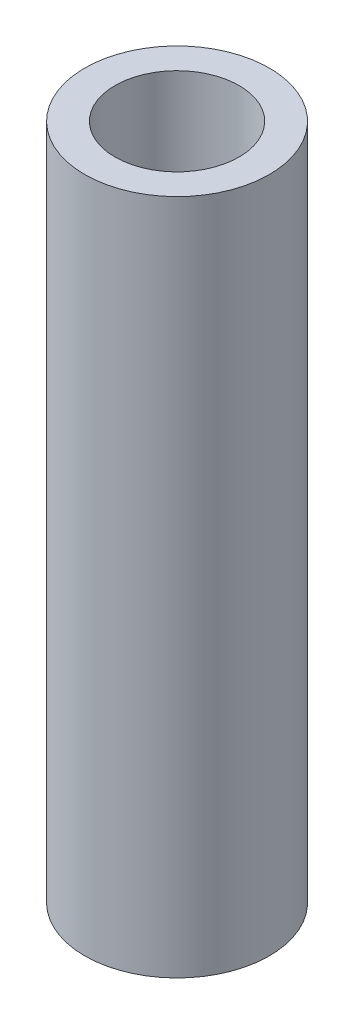
ISO-10303-21;
HEADER;
FILE_DESCRIPTION(('STEP AP214'),'2;1');
FILE_NAME('part.step','',(''),(''),'','','');
FILE_SCHEMA(('AUTOMOTIVE_DESIGN { 1 0 10303 214 1 1 1 1 }'));
ENDSEC;
DATA;
#1=APPLICATION_CONTEXT('core data for automotive mechanical design processes');
#2=APPLICATION_PROTOCOL_DEFINITION('international standard','automotive_design',2000,#1);
#3=PRODUCT_CONTEXT('',#1,'mechanical');
#4=PRODUCT('Part','Part','',(#3));
#5=PRODUCT_RELATED_PRODUCT_CATEGORY('part','',(#4));
#6=PRODUCT_DEFINITION_FORMATION('','',#4);
#7=PRODUCT_DEFINITION_CONTEXT('part definition',#1,'design');
#8=PRODUCT_DEFINITION('design','',#6,#7);
#9=PRODUCT_DEFINITION_SHAPE('','',#8);
#10=(LENGTH_UNIT() NAMED_UNIT(*) SI_UNIT(.MILLI.,.METRE.));
#11=(NAMED_UNIT(*) PLANE_ANGLE_UNIT() SI_UNIT($,.RADIAN.));
#12=(NAMED_UNIT(*) SI_UNIT($,.STERADIAN.) SOLID_ANGLE_UNIT());
#13=UNCERTAINTY_MEASURE_WITH_UNIT(LENGTH_MEASURE(1.E-05),#10,'distance_accuracy_value','');
#14=(GEOMETRIC_REPRESENTATION_CONTEXT(3) GLOBAL_UNCERTAINTY_ASSIGNED_CONTEXT((#13)) GLOBAL_UNIT_ASSIGNED_CONTEXT((#10,
#11,#12)) REPRESENTATION_CONTEXT('',''));
#15=CARTESIAN_POINT('',(0.,0.,0.));
#16=DIRECTION('',(0.,0.,1.));
#17=DIRECTION('',(1.,0.,0.));
#18=AXIS2_PLACEMENT_3D('',#15,#16,#17);
#19=CARTESIAN_POINT('',(0.,34.925,0.));
#20=DIRECTION('',(0.,-1.,0.));
#21=DIRECTION('',(0.,0.,-1.));
#22=AXIS2_PLACEMENT_3D('',#19,#20,#21);
#23=CYLINDRICAL_SURFACE('',#22,4.7625);
#24=CARTESIAN_POINT('',(0.,34.925,0.));
#25=DIRECTION('',(0.,1.,0.));
#26=DIRECTION('',(0.,0.,1.));
#27=AXIS2_PLACEMENT_3D('',#24,#25,#26);
#28=CIRCLE('',#27,4.7625);
#29=CARTESIAN_POINT('',(0.,34.925,4.7625));
#30=VERTEX_POINT('',#29);
#31=EDGE_CURVE('E10',#30,#30,#28,.T.);
#32=ORIENTED_EDGE('',*,*,#31,.F.);
#33=EDGE_LOOP('',(#32));
#34=FACE_BOUND('',#33,.T.);
#35=CARTESIAN_POINT('',(0.,0.,0.));
#36=DIRECTION('',(0.,1.,0.));
#37=DIRECTION('',(0.,0.,1.));
#38=AXIS2_PLACEMENT_3D('',#35,#36,#37);
#39=CIRCLE('',#38,4.7625);
#40=CARTESIAN_POINT('',(0.,0.,4.7625));
#41=VERTEX_POINT('',#40);
#42=EDGE_CURVE('E36',#41,#41,#39,.T.);
#43=ORIENTED_EDGE('',*,*,#42,.T.);
#44=EDGE_LOOP('',(#43));
#45=FACE_BOUND('',#44,.T.);
#46=ADVANCED_FACE('F33',(#34,#45),#23,.T.);
#47=CARTESIAN_POINT('',(0.,34.925,0.));
#48=DIRECTION('',(0.,1.,0.));
#49=DIRECTION('',(0.,0.,1.));
#50=AXIS2_PLACEMENT_3D('',#47,#48,#49);
#51=PLANE('',#50);
#52=CARTESIAN_POINT('',(0.,34.925,0.));
#53=DIRECTION('',(0.,1.,0.));
#54=DIRECTION('',(0.,0.,1.));
#55=AXIS2_PLACEMENT_3D('',#52,#53,#54);
#56=CIRCLE('',#55,3.19999999999999);
#57=CARTESIAN_POINT('',(0.,34.925,3.19999999999999));
#58=VERTEX_POINT('',#57);
#59=EDGE_CURVE('E47',#58,#58,#56,.T.);
#60=ORIENTED_EDGE('',*,*,#59,.F.);
#61=EDGE_LOOP('',(#60));
#62=FACE_BOUND('',#61,.T.);
#63=ORIENTED_EDGE('',*,*,#31,.T.);
#64=EDGE_LOOP('',(#63));
#65=FACE_BOUND('',#64,.T.);
#66=ADVANCED_FACE('F53',(#62,#65),#51,.T.);
#67=CARTESIAN_POINT('',(0.,0.,0.));
#68=DIRECTION('',(0.,1.,0.));
#69=DIRECTION('',(0.,0.,1.));
#70=AXIS2_PLACEMENT_3D('',#67,#68,#69);
#71=PLANE('',#70);
#72=CARTESIAN_POINT('',(0.,0.,0.));
#73=DIRECTION('',(0.,1.,0.));
#74=DIRECTION('',(0.,0.,1.));
#75=AXIS2_PLACEMENT_3D('',#72,#73,#74);
#76=CIRCLE('',#75,3.19999999999999);
#77=CARTESIAN_POINT('',(0.,0.,3.19999999999999));
#78=VERTEX_POINT('',#77);
#79=EDGE_CURVE('E43',#78,#78,#76,.T.);
#80=ORIENTED_EDGE('',*,*,#79,.T.);
#81=EDGE_LOOP('',(#80));
#82=FACE_BOUND('',#81,.T.);
#83=ORIENTED_EDGE('',*,*,#42,.F.);
#84=EDGE_LOOP('',(#83));
#85=FACE_BOUND('',#84,.T.);
#86=ADVANCED_FACE('F55',(#82,#85),#71,.F.);
#87=CARTESIAN_POINT('',(0.,34.925,0.));
#88=DIRECTION('',(0.,1.,0.));
#89=DIRECTION('',(0.,0.,1.));
#90=AXIS2_PLACEMENT_3D('',#87,#88,#89);
#91=CYLINDRICAL_SURFACE('',#90,3.19999999999999);
#92=ORIENTED_EDGE('',*,*,#79,.F.);
#93=EDGE_LOOP('',(#92));
#94=FACE_BOUND('',#93,.T.);
#95=ORIENTED_EDGE('',*,*,#59,.T.);
#96=EDGE_LOOP('',(#95));
#97=FACE_BOUND('',#96,.T.);
#98=ADVANCED_FACE('F51',(#94,#97),#91,.F.);
#99=CLOSED_SHELL('',(#46,#66,#86,#98));
#100=MANIFOLD_SOLID_BREP('B2',#99);
#101=ADVANCED_BREP_SHAPE_REPRESENTATION('',(#18,#100),#14);
#102=SHAPE_DEFINITION_REPRESENTATION(#9,#101);
ENDSEC;
END-ISO-10303-21;
